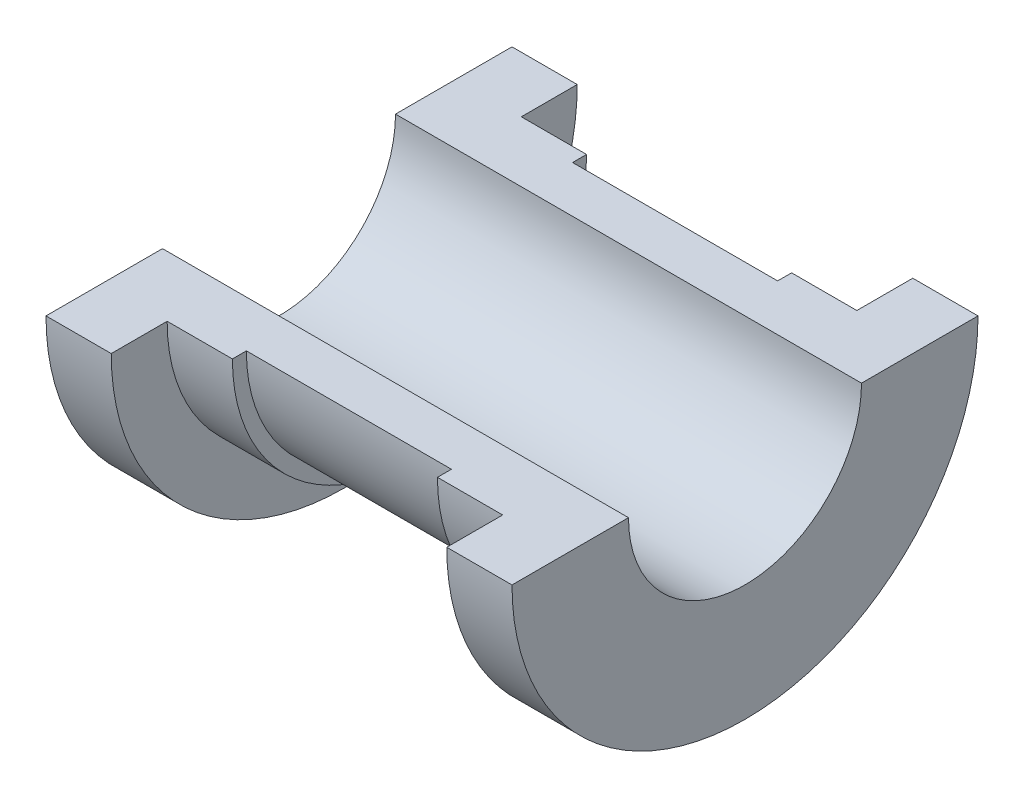
ISO-10303-21;
HEADER;
FILE_DESCRIPTION(('STEP AP214'),'2;1');
FILE_NAME('part.step','',(''),(''),'','','');
FILE_SCHEMA(('AUTOMOTIVE_DESIGN { 1 0 10303 214 1 1 1 1 }'));
ENDSEC;
DATA;
#1=APPLICATION_CONTEXT('core data for automotive mechanical design processes');
#2=APPLICATION_PROTOCOL_DEFINITION('international standard','automotive_design',2000,#1);
#3=PRODUCT_CONTEXT('',#1,'mechanical');
#4=PRODUCT('Part','Part','',(#3));
#5=PRODUCT_RELATED_PRODUCT_CATEGORY('part','',(#4));
#6=PRODUCT_DEFINITION_FORMATION('','',#4);
#7=PRODUCT_DEFINITION_CONTEXT('part definition',#1,'design');
#8=PRODUCT_DEFINITION('design','',#6,#7);
#9=PRODUCT_DEFINITION_SHAPE('','',#8);
#10=(LENGTH_UNIT() NAMED_UNIT(*) SI_UNIT(.MILLI.,.METRE.));
#11=(NAMED_UNIT(*) PLANE_ANGLE_UNIT() SI_UNIT($,.RADIAN.));
#12=(NAMED_UNIT(*) SI_UNIT($,.STERADIAN.) SOLID_ANGLE_UNIT());
#13=UNCERTAINTY_MEASURE_WITH_UNIT(LENGTH_MEASURE(1.E-05),#10,'distance_accuracy_value','');
#14=(GEOMETRIC_REPRESENTATION_CONTEXT(3) GLOBAL_UNCERTAINTY_ASSIGNED_CONTEXT((#13)) GLOBAL_UNIT_ASSIGNED_CONTEXT((#10,
#11,#12)) REPRESENTATION_CONTEXT('',''));
#15=CARTESIAN_POINT('',(0.,0.,0.));
#16=DIRECTION('',(0.,0.,1.));
#17=DIRECTION('',(1.,0.,0.));
#18=AXIS2_PLACEMENT_3D('',#15,#16,#17);
#19=CARTESIAN_POINT('',(0.,-22.5,0.));
#20=DIRECTION('',(0.,1.,0.));
#21=DIRECTION('',(0.,0.,1.));
#22=AXIS2_PLACEMENT_3D('',#19,#20,#21);
#23=CYLINDRICAL_SURFACE('',#22,3.);
#24=CARTESIAN_POINT('',(0.,-22.5,0.));
#25=DIRECTION('',(0.,1.,0.));
#26=DIRECTION('',(0.,0.,1.));
#27=AXIS2_PLACEMENT_3D('',#24,#25,#26);
#28=CIRCLE('',#27,3.);
#29=CARTESIAN_POINT('',(0.,-22.5,3.));
#30=VERTEX_POINT('',#29);
#31=EDGE_CURVE('E11',#30,#30,#28,.T.);
#32=ORIENTED_EDGE('',*,*,#31,.T.);
#33=EDGE_LOOP('',(#32));
#34=FACE_BOUND('',#33,.T.);
#35=CARTESIAN_POINT('',(0.,-17.5,0.));
#36=DIRECTION('',(0.,1.,0.));
#37=DIRECTION('',(0.,0.,1.));
#38=AXIS2_PLACEMENT_3D('',#35,#36,#37);
#39=CIRCLE('',#38,3.);
#40=CARTESIAN_POINT('',(0.,-17.5,3.));
#41=VERTEX_POINT('',#40);
#42=EDGE_CURVE('E54',#41,#41,#39,.T.);
#43=ORIENTED_EDGE('',*,*,#42,.F.);
#44=EDGE_LOOP('',(#43));
#45=FACE_BOUND('',#44,.T.);
#46=ADVANCED_FACE('F51',(#34,#45),#23,.T.);
#47=CARTESIAN_POINT('',(0.,-22.5,0.));
#48=DIRECTION('',(0.,1.,0.));
#49=DIRECTION('',(0.,0.,1.));
#50=AXIS2_PLACEMENT_3D('',#47,#48,#49);
#51=PLANE('',#50);
#52=ORIENTED_EDGE('',*,*,#31,.F.);
#53=EDGE_LOOP('',(#52));
#54=FACE_BOUND('',#53,.T.);
#55=ADVANCED_FACE('F66',(#54),#51,.F.);
#56=CARTESIAN_POINT('',(0.,-17.5,0.));
#57=DIRECTION('',(0.,1.,0.));
#58=DIRECTION('',(0.,0.,1.));
#59=AXIS2_PLACEMENT_3D('',#56,#57,#58);
#60=PLANE('',#59);
#61=ORIENTED_EDGE('',*,*,#42,.T.);
#62=EDGE_LOOP('',(#61));
#63=FACE_BOUND('',#62,.T.);
#64=ADVANCED_FACE('F63',(#63),#60,.T.);
#65=CLOSED_SHELL('',(#46,#55,#64));
#66=MANIFOLD_SOLID_BREP('B2',#65);
#67=CARTESIAN_POINT('',(25.,0.,0.));
#68=DIRECTION('',(-1.,0.,0.));
#69=DIRECTION('',(0.,-1.,0.));
#70=AXIS2_PLACEMENT_3D('',#67,#68,#69);
#71=PLANE('',#70);
#72=DIRECTION('',(0.,0.,-1.));
#73=VECTOR('',#72,1.);
#74=CARTESIAN_POINT('',(25.,0.,0.));
#75=LINE('',#74,#73);
#76=CARTESIAN_POINT('',(25.,0.,25.));
#77=VERTEX_POINT('',#76);
#78=CARTESIAN_POINT('',(25.,0.,12.5));
#79=VERTEX_POINT('',#78);
#80=EDGE_CURVE('E120',#77,#79,#75,.T.);
#81=ORIENTED_EDGE('',*,*,#80,.F.);
#82=CARTESIAN_POINT('',(25.,0.,0.));
#83=DIRECTION('',(-1.,0.,0.));
#84=DIRECTION('',(0.,-1.,0.));
#85=AXIS2_PLACEMENT_3D('',#82,#83,#84);
#86=CIRCLE('',#85,25.);
#87=CARTESIAN_POINT('',(25.,0.,-25.));
#88=VERTEX_POINT('',#87);
#89=EDGE_CURVE('E214',#88,#77,#86,.T.);
#90=ORIENTED_EDGE('',*,*,#89,.F.);
#91=CARTESIAN_POINT('',(25.,0.,-12.5));
#92=VERTEX_POINT('',#91);
#93=EDGE_CURVE('E296',#92,#88,#75,.T.);
#94=ORIENTED_EDGE('',*,*,#93,.F.);
#95=CARTESIAN_POINT('',(25.,0.,0.));
#96=DIRECTION('',(-1.,0.,0.));
#97=DIRECTION('',(0.,-1.,0.));
#98=AXIS2_PLACEMENT_3D('',#95,#96,#97);
#99=CIRCLE('',#98,12.5);
#100=EDGE_CURVE('E195',#92,#79,#99,.T.);
#101=ORIENTED_EDGE('',*,*,#100,.T.);
#102=EDGE_LOOP('',(#81,#90,#94,#101));
#103=FACE_BOUND('',#102,.T.);
#104=ADVANCED_FACE('F98',(#103),#71,.F.);
#105=CARTESIAN_POINT('',(18.,25.,0.));
#106=DIRECTION('',(1.,0.,0.));
#107=DIRECTION('',(0.,1.,0.));
#108=AXIS2_PLACEMENT_3D('',#105,#106,#107);
#109=PLANE('',#108);
#110=DIRECTION('',(0.,0.,1.));
#111=VECTOR('',#110,1.);
#112=CARTESIAN_POINT('',(18.,0.,0.));
#113=LINE('',#112,#111);
#114=CARTESIAN_POINT('',(18.,0.,-25.));
#115=VERTEX_POINT('',#114);
#116=CARTESIAN_POINT('',(18.,0.,-19.));
#117=VERTEX_POINT('',#116);
#118=EDGE_CURVE('E268',#115,#117,#113,.T.);
#119=ORIENTED_EDGE('',*,*,#118,.F.);
#120=CARTESIAN_POINT('',(18.,0.,0.));
#121=DIRECTION('',(-1.,0.,0.));
#122=DIRECTION('',(0.,-1.,0.));
#123=AXIS2_PLACEMENT_3D('',#120,#121,#122);
#124=CIRCLE('',#123,25.);
#125=CARTESIAN_POINT('',(18.,0.,25.));
#126=VERTEX_POINT('',#125);
#127=EDGE_CURVE('E216',#115,#126,#124,.T.);
#128=ORIENTED_EDGE('',*,*,#127,.T.);
#129=CARTESIAN_POINT('',(18.,0.,19.));
#130=VERTEX_POINT('',#129);
#131=EDGE_CURVE('E196',#130,#126,#113,.T.);
#132=ORIENTED_EDGE('',*,*,#131,.F.);
#133=CARTESIAN_POINT('',(18.,0.,0.));
#134=DIRECTION('',(-1.,0.,0.));
#135=DIRECTION('',(0.,-1.,0.));
#136=AXIS2_PLACEMENT_3D('',#133,#134,#135);
#137=CIRCLE('',#136,19.);
#138=EDGE_CURVE('E222',#117,#130,#137,.T.);
#139=ORIENTED_EDGE('',*,*,#138,.F.);
#140=EDGE_LOOP('',(#119,#128,#132,#139));
#141=FACE_BOUND('',#140,.T.);
#142=ADVANCED_FACE('F333',(#141),#109,.F.);
#143=CARTESIAN_POINT('',(-25.,0.,0.));
#144=DIRECTION('',(-1.,0.,0.));
#145=DIRECTION('',(0.,-1.,0.));
#146=AXIS2_PLACEMENT_3D('',#143,#144,#145);
#147=CYLINDRICAL_SURFACE('',#146,19.);
#148=DIRECTION('',(-1.,0.,0.));
#149=VECTOR('',#148,1.);
#150=CARTESIAN_POINT('',(-25.,0.,-19.));
#151=LINE('',#150,#149);
#152=CARTESIAN_POINT('',(11.,0.,-19.));
#153=VERTEX_POINT('',#152);
#154=EDGE_CURVE('E272',#117,#153,#151,.T.);
#155=ORIENTED_EDGE('',*,*,#154,.F.);
#156=ORIENTED_EDGE('',*,*,#138,.T.);
#157=DIRECTION('',(-1.,0.,0.));
#158=VECTOR('',#157,1.);
#159=CARTESIAN_POINT('',(-25.,0.,19.));
#160=LINE('',#159,#158);
#161=CARTESIAN_POINT('',(11.,0.,19.));
#162=VERTEX_POINT('',#161);
#163=EDGE_CURVE('E254',#162,#130,#160,.F.);
#164=ORIENTED_EDGE('',*,*,#163,.F.);
#165=CARTESIAN_POINT('',(11.,0.,0.));
#166=DIRECTION('',(-1.,0.,0.));
#167=DIRECTION('',(0.,-1.,0.));
#168=AXIS2_PLACEMENT_3D('',#165,#166,#167);
#169=CIRCLE('',#168,19.);
#170=EDGE_CURVE('E226',#153,#162,#169,.T.);
#171=ORIENTED_EDGE('',*,*,#170,.F.);
#172=EDGE_LOOP('',(#155,#156,#164,#171));
#173=FACE_BOUND('',#172,.T.);
#174=ADVANCED_FACE('F344',(#173),#147,.T.);
#175=CARTESIAN_POINT('',(11.,19.,0.));
#176=DIRECTION('',(1.,0.,0.));
#177=DIRECTION('',(0.,1.,0.));
#178=AXIS2_PLACEMENT_3D('',#175,#176,#177);
#179=PLANE('',#178);
#180=DIRECTION('',(0.,0.,1.));
#181=VECTOR('',#180,1.);
#182=CARTESIAN_POINT('',(11.,0.,0.));
#183=LINE('',#182,#181);
#184=CARTESIAN_POINT('',(11.,0.,-17.5));
#185=VERTEX_POINT('',#184);
#186=EDGE_CURVE('E276',#153,#185,#183,.T.);
#187=ORIENTED_EDGE('',*,*,#186,.F.);
#188=ORIENTED_EDGE('',*,*,#170,.T.);
#189=CARTESIAN_POINT('',(11.,0.,17.5));
#190=VERTEX_POINT('',#189);
#191=EDGE_CURVE('E257',#190,#162,#183,.T.);
#192=ORIENTED_EDGE('',*,*,#191,.F.);
#193=CARTESIAN_POINT('',(11.,0.,0.));
#194=DIRECTION('',(-1.,0.,0.));
#195=DIRECTION('',(0.,-1.,0.));
#196=AXIS2_PLACEMENT_3D('',#193,#194,#195);
#197=CIRCLE('',#196,17.5);
#198=EDGE_CURVE('E230',#185,#190,#197,.T.);
#199=ORIENTED_EDGE('',*,*,#198,.F.);
#200=EDGE_LOOP('',(#187,#188,#192,#199));
#201=FACE_BOUND('',#200,.T.);
#202=ADVANCED_FACE('F339',(#201),#179,.F.);
#203=CARTESIAN_POINT('',(-25.,0.,0.));
#204=DIRECTION('',(-1.,0.,0.));
#205=DIRECTION('',(0.,-1.,0.));
#206=AXIS2_PLACEMENT_3D('',#203,#204,#205);
#207=CYLINDRICAL_SURFACE('',#206,17.5);
#208=DIRECTION('',(-1.,0.,0.));
#209=VECTOR('',#208,1.);
#210=CARTESIAN_POINT('',(-25.,0.,-17.5));
#211=LINE('',#210,#209);
#212=CARTESIAN_POINT('',(-11.,0.,-17.5));
#213=VERTEX_POINT('',#212);
#214=EDGE_CURVE('E280',#185,#213,#211,.T.);
#215=ORIENTED_EDGE('',*,*,#214,.F.);
#216=ORIENTED_EDGE('',*,*,#198,.T.);
#217=DIRECTION('',(-1.,0.,0.));
#218=VECTOR('',#217,1.);
#219=CARTESIAN_POINT('',(-25.,0.,17.5));
#220=LINE('',#219,#218);
#221=CARTESIAN_POINT('',(-11.,0.,17.5));
#222=VERTEX_POINT('',#221);
#223=EDGE_CURVE('E258',#222,#190,#220,.F.);
#224=ORIENTED_EDGE('',*,*,#223,.F.);
#225=CARTESIAN_POINT('',(-11.,0.,0.));
#226=DIRECTION('',(-1.,0.,0.));
#227=DIRECTION('',(0.,-1.,0.));
#228=AXIS2_PLACEMENT_3D('',#225,#226,#227);
#229=CIRCLE('',#228,17.5);
#230=EDGE_CURVE('E234',#213,#222,#229,.T.);
#231=ORIENTED_EDGE('',*,*,#230,.F.);
#232=EDGE_LOOP('',(#215,#216,#224,#231));
#233=FACE_BOUND('',#232,.T.);
#234=ADVANCED_FACE('F342',(#233),#207,.T.);
#235=CARTESIAN_POINT('',(-11.,19.,0.));
#236=DIRECTION('',(-1.,0.,0.));
#237=DIRECTION('',(0.,-1.,0.));
#238=AXIS2_PLACEMENT_3D('',#235,#236,#237);
#239=PLANE('',#238);
#240=DIRECTION('',(0.,0.,-1.));
#241=VECTOR('',#240,1.);
#242=CARTESIAN_POINT('',(-11.,0.,0.));
#243=LINE('',#242,#241);
#244=CARTESIAN_POINT('',(-11.,0.,19.));
#245=VERTEX_POINT('',#244);
#246=EDGE_CURVE('E262',#245,#222,#243,.T.);
#247=ORIENTED_EDGE('',*,*,#246,.F.);
#248=CARTESIAN_POINT('',(-11.,0.,0.));
#249=DIRECTION('',(-1.,0.,0.));
#250=DIRECTION('',(0.,-1.,0.));
#251=AXIS2_PLACEMENT_3D('',#248,#249,#250);
#252=CIRCLE('',#251,19.);
#253=CARTESIAN_POINT('',(-11.,0.,-19.));
#254=VERTEX_POINT('',#253);
#255=EDGE_CURVE('E238',#254,#245,#252,.T.);
#256=ORIENTED_EDGE('',*,*,#255,.F.);
#257=EDGE_CURVE('E284',#213,#254,#243,.T.);
#258=ORIENTED_EDGE('',*,*,#257,.F.);
#259=ORIENTED_EDGE('',*,*,#230,.T.);
#260=EDGE_LOOP('',(#247,#256,#258,#259));
#261=FACE_BOUND('',#260,.T.);
#262=ADVANCED_FACE('F321',(#261),#239,.F.);
#263=CARTESIAN_POINT('',(-25.,0.,0.));
#264=DIRECTION('',(-1.,0.,0.));
#265=DIRECTION('',(0.,-1.,0.));
#266=AXIS2_PLACEMENT_3D('',#263,#264,#265);
#267=CYLINDRICAL_SURFACE('',#266,19.);
#268=DIRECTION('',(-1.,0.,0.));
#269=VECTOR('',#268,1.);
#270=CARTESIAN_POINT('',(-25.,0.,-19.));
#271=LINE('',#270,#269);
#272=CARTESIAN_POINT('',(-18.,0.,-19.));
#273=VERTEX_POINT('',#272);
#274=EDGE_CURVE('E288',#254,#273,#271,.T.);
#275=ORIENTED_EDGE('',*,*,#274,.F.);
#276=ORIENTED_EDGE('',*,*,#255,.T.);
#277=DIRECTION('',(-1.,0.,0.));
#278=VECTOR('',#277,1.);
#279=CARTESIAN_POINT('',(-25.,0.,19.));
#280=LINE('',#279,#278);
#281=CARTESIAN_POINT('',(-18.,0.,19.));
#282=VERTEX_POINT('',#281);
#283=EDGE_CURVE('E263',#282,#245,#280,.F.);
#284=ORIENTED_EDGE('',*,*,#283,.F.);
#285=CARTESIAN_POINT('',(-18.,0.,0.));
#286=DIRECTION('',(-1.,0.,0.));
#287=DIRECTION('',(0.,-1.,0.));
#288=AXIS2_PLACEMENT_3D('',#285,#286,#287);
#289=CIRCLE('',#288,19.);
#290=EDGE_CURVE('E242',#273,#282,#289,.T.);
#291=ORIENTED_EDGE('',*,*,#290,.F.);
#292=EDGE_LOOP('',(#275,#276,#284,#291));
#293=FACE_BOUND('',#292,.T.);
#294=ADVANCED_FACE('F319',(#293),#267,.T.);
#295=CARTESIAN_POINT('',(-18.,25.,0.));
#296=DIRECTION('',(-1.,0.,0.));
#297=DIRECTION('',(0.,-1.,0.));
#298=AXIS2_PLACEMENT_3D('',#295,#296,#297);
#299=PLANE('',#298);
#300=DIRECTION('',(0.,0.,-1.));
#301=VECTOR('',#300,1.);
#302=CARTESIAN_POINT('',(-18.,0.,0.));
#303=LINE('',#302,#301);
#304=CARTESIAN_POINT('',(-18.,0.,25.));
#305=VERTEX_POINT('',#304);
#306=EDGE_CURVE('E267',#305,#282,#303,.T.);
#307=ORIENTED_EDGE('',*,*,#306,.F.);
#308=CARTESIAN_POINT('',(-18.,0.,0.));
#309=DIRECTION('',(-1.,0.,0.));
#310=DIRECTION('',(0.,-1.,0.));
#311=AXIS2_PLACEMENT_3D('',#308,#309,#310);
#312=CIRCLE('',#311,25.);
#313=CARTESIAN_POINT('',(-18.,0.,-25.));
#314=VERTEX_POINT('',#313);
#315=EDGE_CURVE('E246',#314,#305,#312,.T.);
#316=ORIENTED_EDGE('',*,*,#315,.F.);
#317=EDGE_CURVE('E292',#273,#314,#303,.T.);
#318=ORIENTED_EDGE('',*,*,#317,.F.);
#319=ORIENTED_EDGE('',*,*,#290,.T.);
#320=EDGE_LOOP('',(#307,#316,#318,#319));
#321=FACE_BOUND('',#320,.T.);
#322=ADVANCED_FACE('F313',(#321),#299,.F.);
#323=CARTESIAN_POINT('',(-25.,0.,0.));
#324=DIRECTION('',(1.,0.,0.));
#325=DIRECTION('',(0.,1.,0.));
#326=AXIS2_PLACEMENT_3D('',#323,#324,#325);
#327=PLANE('',#326);
#328=DIRECTION('',(0.,0.,1.));
#329=VECTOR('',#328,1.);
#330=CARTESIAN_POINT('',(-25.,0.,0.));
#331=LINE('',#330,#329);
#332=CARTESIAN_POINT('',(-25.,0.,-25.));
#333=VERTEX_POINT('',#332);
#334=CARTESIAN_POINT('',(-25.,0.,-12.5));
#335=VERTEX_POINT('',#334);
#336=EDGE_CURVE('E209',#333,#335,#331,.T.);
#337=ORIENTED_EDGE('',*,*,#336,.F.);
#338=CARTESIAN_POINT('',(-25.,0.,0.));
#339=DIRECTION('',(-1.,0.,0.));
#340=DIRECTION('',(0.,-1.,0.));
#341=AXIS2_PLACEMENT_3D('',#338,#339,#340);
#342=CIRCLE('',#341,25.);
#343=CARTESIAN_POINT('',(-25.,0.,25.));
#344=VERTEX_POINT('',#343);
#345=EDGE_CURVE('E203',#333,#344,#342,.T.);
#346=ORIENTED_EDGE('',*,*,#345,.T.);
#347=CARTESIAN_POINT('',(-25.,0.,12.5));
#348=VERTEX_POINT('',#347);
#349=EDGE_CURVE('E200',#348,#344,#331,.T.);
#350=ORIENTED_EDGE('',*,*,#349,.F.);
#351=CARTESIAN_POINT('',(-25.,0.,0.));
#352=DIRECTION('',(-1.,0.,0.));
#353=DIRECTION('',(0.,-1.,0.));
#354=AXIS2_PLACEMENT_3D('',#351,#352,#353);
#355=CIRCLE('',#354,12.5);
#356=EDGE_CURVE('E188',#335,#348,#355,.T.);
#357=ORIENTED_EDGE('',*,*,#356,.F.);
#358=EDGE_LOOP('',(#337,#346,#350,#357));
#359=FACE_BOUND('',#358,.T.);
#360=ADVANCED_FACE('F201',(#359),#327,.F.);
#361=CARTESIAN_POINT('',(25.,0.,0.));
#362=DIRECTION('',(-1.,0.,0.));
#363=DIRECTION('',(0.,-1.,0.));
#364=AXIS2_PLACEMENT_3D('',#361,#362,#363);
#365=CYLINDRICAL_SURFACE('',#364,12.5);
#366=DIRECTION('',(-1.,0.,0.));
#367=VECTOR('',#366,1.);
#368=CARTESIAN_POINT('',(25.,0.,-12.5));
#369=LINE('',#368,#367);
#370=EDGE_CURVE('E49',#335,#92,#369,.F.);
#371=ORIENTED_EDGE('',*,*,#370,.F.);
#372=ORIENTED_EDGE('',*,*,#356,.T.);
#373=DIRECTION('',(-1.,0.,0.));
#374=VECTOR('',#373,1.);
#375=CARTESIAN_POINT('',(25.,0.,12.5));
#376=LINE('',#375,#374);
#377=EDGE_CURVE('E106',#79,#348,#376,.T.);
#378=ORIENTED_EDGE('',*,*,#377,.F.);
#379=ORIENTED_EDGE('',*,*,#100,.F.);
#380=EDGE_LOOP('',(#371,#372,#378,#379));
#381=FACE_BOUND('',#380,.T.);
#382=ADVANCED_FACE('F190',(#381),#365,.F.);
#383=CARTESIAN_POINT('',(-25.,0.,0.));
#384=DIRECTION('',(-1.,0.,0.));
#385=DIRECTION('',(0.,-1.,0.));
#386=AXIS2_PLACEMENT_3D('',#383,#384,#385);
#387=CYLINDRICAL_SURFACE('',#386,25.);
#388=ORIENTED_EDGE('',*,*,#127,.F.);
#389=DIRECTION('',(1.,0.,0.));
#390=VECTOR('',#389,1.);
#391=CARTESIAN_POINT('',(-195.753175473055,0.,-25.));
#392=LINE('',#391,#390);
#393=EDGE_CURVE('E113',#115,#88,#392,.T.);
#394=ORIENTED_EDGE('',*,*,#393,.T.);
#395=ORIENTED_EDGE('',*,*,#89,.T.);
#396=DIRECTION('',(1.,0.,0.));
#397=VECTOR('',#396,1.);
#398=CARTESIAN_POINT('',(-195.753175473055,0.,25.));
#399=LINE('',#398,#397);
#400=EDGE_CURVE('E302',#126,#77,#399,.T.);
#401=ORIENTED_EDGE('',*,*,#400,.F.);
#402=EDGE_LOOP('',(#388,#394,#395,#401));
#403=FACE_BOUND('',#402,.T.);
#404=ADVANCED_FACE('F331',(#403),#387,.T.);
#405=CARTESIAN_POINT('',(-25.,0.,0.));
#406=DIRECTION('',(-1.,0.,0.));
#407=DIRECTION('',(0.,-1.,0.));
#408=AXIS2_PLACEMENT_3D('',#405,#406,#407);
#409=CYLINDRICAL_SURFACE('',#408,25.);
#410=ORIENTED_EDGE('',*,*,#345,.F.);
#411=EDGE_CURVE('E301',#333,#314,#392,.T.);
#412=ORIENTED_EDGE('',*,*,#411,.T.);
#413=ORIENTED_EDGE('',*,*,#315,.T.);
#414=EDGE_CURVE('E207',#344,#305,#399,.T.);
#415=ORIENTED_EDGE('',*,*,#414,.F.);
#416=EDGE_LOOP('',(#410,#412,#413,#415));
#417=FACE_BOUND('',#416,.T.);
#418=ADVANCED_FACE('F310',(#417),#409,.T.);
#419=CARTESIAN_POINT('',(-195.753175473055,0.,-25.));
#420=DIRECTION('',(0.,1.,0.));
#421=DIRECTION('',(-1.,0.,0.));
#422=AXIS2_PLACEMENT_3D('',#419,#420,#421);
#423=PLANE('',#422);
#424=ORIENTED_EDGE('',*,*,#163,.T.);
#425=ORIENTED_EDGE('',*,*,#131,.T.);
#426=ORIENTED_EDGE('',*,*,#400,.T.);
#427=ORIENTED_EDGE('',*,*,#80,.T.);
#428=ORIENTED_EDGE('',*,*,#377,.T.);
#429=ORIENTED_EDGE('',*,*,#349,.T.);
#430=ORIENTED_EDGE('',*,*,#414,.T.);
#431=ORIENTED_EDGE('',*,*,#306,.T.);
#432=ORIENTED_EDGE('',*,*,#283,.T.);
#433=ORIENTED_EDGE('',*,*,#246,.T.);
#434=ORIENTED_EDGE('',*,*,#223,.T.);
#435=ORIENTED_EDGE('',*,*,#191,.T.);
#436=EDGE_LOOP('',(#424,#425,#426,#427,#428,#429,#430,#431,#432,#433,#434,#435));
#437=FACE_BOUND('',#436,.T.);
#438=ADVANCED_FACE('F211',(#437),#423,.T.);
#439=ORIENTED_EDGE('',*,*,#393,.F.);
#440=ORIENTED_EDGE('',*,*,#118,.T.);
#441=ORIENTED_EDGE('',*,*,#154,.T.);
#442=ORIENTED_EDGE('',*,*,#186,.T.);
#443=ORIENTED_EDGE('',*,*,#214,.T.);
#444=ORIENTED_EDGE('',*,*,#257,.T.);
#445=ORIENTED_EDGE('',*,*,#274,.T.);
#446=ORIENTED_EDGE('',*,*,#317,.T.);
#447=ORIENTED_EDGE('',*,*,#411,.F.);
#448=ORIENTED_EDGE('',*,*,#336,.T.);
#449=ORIENTED_EDGE('',*,*,#370,.T.);
#450=ORIENTED_EDGE('',*,*,#93,.T.);
#451=EDGE_LOOP('',(#439,#440,#441,#442,#443,#444,#445,#446,#447,#448,#449,#450));
#452=FACE_BOUND('',#451,.T.);
#453=ADVANCED_FACE('F316',(#452),#423,.T.);
#454=CLOSED_SHELL('',(#104,#142,#174,#202,#234,#262,#294,#322,#360,#382,#404,#418,#438,#453));
#455=MANIFOLD_SOLID_BREP('B6',#454);
#456=ADVANCED_BREP_SHAPE_REPRESENTATION('',(#18,#66,#455),#14);
#457=SHAPE_DEFINITION_REPRESENTATION(#9,#456);
ENDSEC;
END-ISO-10303-21;
